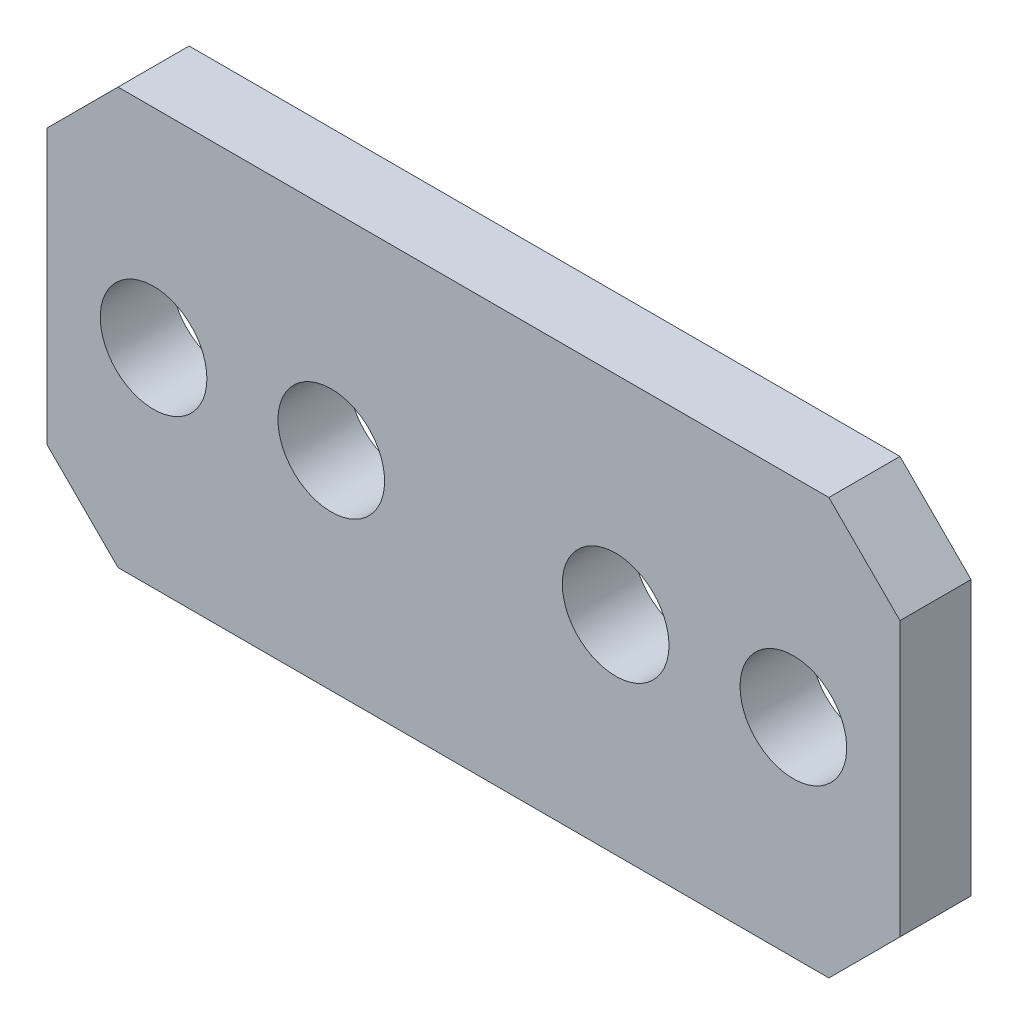
ISO-10303-21;
HEADER;
FILE_DESCRIPTION(('STEP AP214'),'2;1');
FILE_NAME('part.step','',(''),(''),'','','');
FILE_SCHEMA(('AUTOMOTIVE_DESIGN { 1 0 10303 214 1 1 1 1 }'));
ENDSEC;
DATA;
#1=APPLICATION_CONTEXT('core data for automotive mechanical design processes');
#2=APPLICATION_PROTOCOL_DEFINITION('international standard','automotive_design',2000,#1);
#3=PRODUCT_CONTEXT('',#1,'mechanical');
#4=PRODUCT('Part','Part','',(#3));
#5=PRODUCT_RELATED_PRODUCT_CATEGORY('part','',(#4));
#6=PRODUCT_DEFINITION_FORMATION('','',#4);
#7=PRODUCT_DEFINITION_CONTEXT('part definition',#1,'design');
#8=PRODUCT_DEFINITION('design','',#6,#7);
#9=PRODUCT_DEFINITION_SHAPE('','',#8);
#10=(LENGTH_UNIT() NAMED_UNIT(*) SI_UNIT(.MILLI.,.METRE.));
#11=(NAMED_UNIT(*) PLANE_ANGLE_UNIT() SI_UNIT($,.RADIAN.));
#12=(NAMED_UNIT(*) SI_UNIT($,.STERADIAN.) SOLID_ANGLE_UNIT());
#13=UNCERTAINTY_MEASURE_WITH_UNIT(LENGTH_MEASURE(1.E-05),#10,'distance_accuracy_value','');
#14=(GEOMETRIC_REPRESENTATION_CONTEXT(3) GLOBAL_UNCERTAINTY_ASSIGNED_CONTEXT((#13)) GLOBAL_UNIT_ASSIGNED_CONTEXT((#10,
#11,#12)) REPRESENTATION_CONTEXT('',''));
#15=CARTESIAN_POINT('',(0.,0.,0.));
#16=DIRECTION('',(0.,0.,1.));
#17=DIRECTION('',(1.,0.,0.));
#18=AXIS2_PLACEMENT_3D('',#15,#16,#17);
#19=CARTESIAN_POINT('',(0.,0.,2.));
#20=DIRECTION('',(0.,0.,1.));
#21=DIRECTION('',(1.,0.,0.));
#22=AXIS2_PLACEMENT_3D('',#19,#20,#21);
#23=PLANE('',#22);
#24=CARTESIAN_POINT('',(4.,0.,2.));
#25=DIRECTION('',(0.,0.,1.));
#26=DIRECTION('',(-1.,0.,0.));
#27=AXIS2_PLACEMENT_3D('',#24,#25,#26);
#28=CIRCLE('',#27,1.5);
#29=CARTESIAN_POINT('',(2.5,0.,2.));
#30=VERTEX_POINT('',#29);
#31=EDGE_CURVE('E188',#30,#30,#28,.T.);
#32=ORIENTED_EDGE('',*,*,#31,.F.);
#33=EDGE_LOOP('',(#32));
#34=FACE_BOUND('',#33,.T.);
#35=CARTESIAN_POINT('',(-9.,0.,2.));
#36=DIRECTION('',(0.,0.,1.));
#37=DIRECTION('',(1.,0.,0.));
#38=AXIS2_PLACEMENT_3D('',#35,#36,#37);
#39=CIRCLE('',#38,1.5);
#40=CARTESIAN_POINT('',(-7.5,0.,2.));
#41=VERTEX_POINT('',#40);
#42=EDGE_CURVE('E134',#41,#41,#39,.T.);
#43=ORIENTED_EDGE('',*,*,#42,.F.);
#44=EDGE_LOOP('',(#43));
#45=FACE_BOUND('',#44,.T.);
#46=DIRECTION('',(0.,1.,0.));
#47=VECTOR('',#46,1.);
#48=CARTESIAN_POINT('',(12.,5.85424868893541,2.));
#49=LINE('',#48,#47);
#50=CARTESIAN_POINT('',(12.,-3.8542486889354,2.));
#51=VERTEX_POINT('',#50);
#52=CARTESIAN_POINT('',(12.,3.8542486889354,2.));
#53=VERTEX_POINT('',#52);
#54=EDGE_CURVE('E139',#51,#53,#49,.T.);
#55=ORIENTED_EDGE('',*,*,#54,.T.);
#56=DIRECTION('',(0.707106781186547,-0.707106781186548,0.));
#57=VECTOR('',#56,1.);
#58=CARTESIAN_POINT('',(7.92712434446771,7.92712434446769,2.));
#59=LINE('',#58,#57);
#60=CARTESIAN_POINT('',(10.,5.85424868893541,2.));
#61=VERTEX_POINT('',#60);
#62=EDGE_CURVE('E154',#53,#61,#59,.F.);
#63=ORIENTED_EDGE('',*,*,#62,.T.);
#64=DIRECTION('',(-1.,0.,0.));
#65=VECTOR('',#64,1.);
#66=CARTESIAN_POINT('',(-12.,5.85424868893541,2.));
#67=LINE('',#66,#65);
#68=CARTESIAN_POINT('',(-9.99999999999999,5.85424868893541,2.));
#69=VERTEX_POINT('',#68);
#70=EDGE_CURVE('E121',#61,#69,#67,.T.);
#71=ORIENTED_EDGE('',*,*,#70,.T.);
#72=DIRECTION('',(0.707106781186549,0.707106781186546,0.));
#73=VECTOR('',#72,1.);
#74=CARTESIAN_POINT('',(-7.92712434446768,7.92712434446771,2.));
#75=LINE('',#74,#73);
#76=CARTESIAN_POINT('',(-12.,3.8542486889354,2.));
#77=VERTEX_POINT('',#76);
#78=EDGE_CURVE('E149',#69,#77,#75,.F.);
#79=ORIENTED_EDGE('',*,*,#78,.T.);
#80=DIRECTION('',(0.,-1.,0.));
#81=VECTOR('',#80,1.);
#82=CARTESIAN_POINT('',(-12.,5.85424868893541,2.));
#83=LINE('',#82,#81);
#84=CARTESIAN_POINT('',(-12.,-3.85424868893539,2.));
#85=VERTEX_POINT('',#84);
#86=EDGE_CURVE('E165',#77,#85,#83,.T.);
#87=ORIENTED_EDGE('',*,*,#86,.T.);
#88=DIRECTION('',(-0.707106781186546,0.707106781186549,0.));
#89=VECTOR('',#88,1.);
#90=CARTESIAN_POINT('',(-7.92712434446772,-7.92712434446769,2.));
#91=LINE('',#90,#89);
#92=CARTESIAN_POINT('',(-10.,-5.85424868893541,2.));
#93=VERTEX_POINT('',#92);
#94=EDGE_CURVE('E57',#85,#93,#91,.F.);
#95=ORIENTED_EDGE('',*,*,#94,.T.);
#96=DIRECTION('',(1.,0.,0.));
#97=VECTOR('',#96,1.);
#98=CARTESIAN_POINT('',(-12.,-5.85424868893541,2.));
#99=LINE('',#98,#97);
#100=CARTESIAN_POINT('',(9.99999999999999,-5.85424868893541,2.));
#101=VERTEX_POINT('',#100);
#102=EDGE_CURVE('E140',#93,#101,#99,.T.);
#103=ORIENTED_EDGE('',*,*,#102,.T.);
#104=DIRECTION('',(-0.707106781186549,-0.707106781186546,0.));
#105=VECTOR('',#104,1.);
#106=CARTESIAN_POINT('',(7.92712434446768,-7.92712434446771,2.));
#107=LINE('',#106,#105);
#108=EDGE_CURVE('E152',#101,#51,#107,.F.);
#109=ORIENTED_EDGE('',*,*,#108,.T.);
#110=EDGE_LOOP('',(#55,#63,#71,#79,#87,#95,#103,#109));
#111=FACE_BOUND('',#110,.T.);
#112=CARTESIAN_POINT('',(-4.,0.,2.));
#113=DIRECTION('',(0.,0.,1.));
#114=DIRECTION('',(1.,0.,0.));
#115=AXIS2_PLACEMENT_3D('',#112,#113,#114);
#116=CIRCLE('',#115,1.5);
#117=CARTESIAN_POINT('',(-2.5,0.,2.));
#118=VERTEX_POINT('',#117);
#119=EDGE_CURVE('E182',#118,#118,#116,.T.);
#120=ORIENTED_EDGE('',*,*,#119,.F.);
#121=EDGE_LOOP('',(#120));
#122=FACE_BOUND('',#121,.T.);
#123=CARTESIAN_POINT('',(9.,0.,2.));
#124=DIRECTION('',(0.,0.,1.));
#125=DIRECTION('',(-1.,0.,0.));
#126=AXIS2_PLACEMENT_3D('',#123,#124,#125);
#127=CIRCLE('',#126,1.5);
#128=CARTESIAN_POINT('',(7.5,0.,2.));
#129=VERTEX_POINT('',#128);
#130=EDGE_CURVE('E194',#129,#129,#127,.T.);
#131=ORIENTED_EDGE('',*,*,#130,.F.);
#132=EDGE_LOOP('',(#131));
#133=FACE_BOUND('',#132,.T.);
#134=ADVANCED_FACE('F35',(#34,#45,#111,#122,#133),#23,.T.);
#135=CARTESIAN_POINT('',(0.,0.,0.));
#136=DIRECTION('',(0.,0.,1.));
#137=DIRECTION('',(1.,0.,0.));
#138=AXIS2_PLACEMENT_3D('',#135,#136,#137);
#139=PLANE('',#138);
#140=DIRECTION('',(-1.,0.,0.));
#141=VECTOR('',#140,1.);
#142=CARTESIAN_POINT('',(-12.,5.85424868893541,0.));
#143=LINE('',#142,#141);
#144=CARTESIAN_POINT('',(10.,5.85424868893541,0.));
#145=VERTEX_POINT('',#144);
#146=CARTESIAN_POINT('',(-9.99999999999999,5.85424868893541,0.));
#147=VERTEX_POINT('',#146);
#148=EDGE_CURVE('E118',#145,#147,#143,.T.);
#149=ORIENTED_EDGE('',*,*,#148,.F.);
#150=DIRECTION('',(-0.707106781186547,0.707106781186548,0.));
#151=VECTOR('',#150,1.);
#152=CARTESIAN_POINT('',(10.,5.85424868893541,0.));
#153=LINE('',#152,#151);
#154=CARTESIAN_POINT('',(12.,3.8542486889354,0.));
#155=VERTEX_POINT('',#154);
#156=EDGE_CURVE('E101',#145,#155,#153,.F.);
#157=ORIENTED_EDGE('',*,*,#156,.T.);
#158=DIRECTION('',(0.,1.,0.));
#159=VECTOR('',#158,1.);
#160=CARTESIAN_POINT('',(12.,5.85424868893541,0.));
#161=LINE('',#160,#159);
#162=CARTESIAN_POINT('',(12.,-3.8542486889354,0.));
#163=VERTEX_POINT('',#162);
#164=EDGE_CURVE('E129',#163,#155,#161,.T.);
#165=ORIENTED_EDGE('',*,*,#164,.F.);
#166=DIRECTION('',(0.707106781186549,0.707106781186546,0.));
#167=VECTOR('',#166,1.);
#168=CARTESIAN_POINT('',(12.,-3.8542486889354,0.));
#169=LINE('',#168,#167);
#170=CARTESIAN_POINT('',(9.99999999999999,-5.85424868893541,0.));
#171=VERTEX_POINT('',#170);
#172=EDGE_CURVE('E112',#163,#171,#169,.F.);
#173=ORIENTED_EDGE('',*,*,#172,.T.);
#174=DIRECTION('',(1.,0.,0.));
#175=VECTOR('',#174,1.);
#176=CARTESIAN_POINT('',(-12.,-5.85424868893541,0.));
#177=LINE('',#176,#175);
#178=CARTESIAN_POINT('',(-10.,-5.85424868893541,0.));
#179=VERTEX_POINT('',#178);
#180=EDGE_CURVE('E132',#179,#171,#177,.T.);
#181=ORIENTED_EDGE('',*,*,#180,.F.);
#182=DIRECTION('',(0.707106781186546,-0.707106781186549,0.));
#183=VECTOR('',#182,1.);
#184=CARTESIAN_POINT('',(-10.,-5.85424868893541,0.));
#185=LINE('',#184,#183);
#186=CARTESIAN_POINT('',(-12.,-3.85424868893539,0.));
#187=VERTEX_POINT('',#186);
#188=EDGE_CURVE('E143',#179,#187,#185,.F.);
#189=ORIENTED_EDGE('',*,*,#188,.T.);
#190=DIRECTION('',(0.,-1.,0.));
#191=VECTOR('',#190,1.);
#192=CARTESIAN_POINT('',(-12.,5.85424868893541,0.));
#193=LINE('',#192,#191);
#194=CARTESIAN_POINT('',(-12.,3.8542486889354,0.));
#195=VERTEX_POINT('',#194);
#196=EDGE_CURVE('E128',#195,#187,#193,.T.);
#197=ORIENTED_EDGE('',*,*,#196,.F.);
#198=DIRECTION('',(-0.707106781186549,-0.707106781186546,0.));
#199=VECTOR('',#198,1.);
#200=CARTESIAN_POINT('',(-12.,3.8542486889354,0.));
#201=LINE('',#200,#199);
#202=EDGE_CURVE('E122',#195,#147,#201,.F.);
#203=ORIENTED_EDGE('',*,*,#202,.T.);
#204=EDGE_LOOP('',(#149,#157,#165,#173,#181,#189,#197,#203));
#205=FACE_BOUND('',#204,.T.);
#206=CARTESIAN_POINT('',(-9.,0.,0.));
#207=DIRECTION('',(0.,0.,1.));
#208=DIRECTION('',(1.,0.,0.));
#209=AXIS2_PLACEMENT_3D('',#206,#207,#208);
#210=CIRCLE('',#209,1.5);
#211=CARTESIAN_POINT('',(-7.5,0.,0.));
#212=VERTEX_POINT('',#211);
#213=EDGE_CURVE('E179',#212,#212,#210,.T.);
#214=ORIENTED_EDGE('',*,*,#213,.T.);
#215=EDGE_LOOP('',(#214));
#216=FACE_BOUND('',#215,.T.);
#217=CARTESIAN_POINT('',(-4.,0.,0.));
#218=DIRECTION('',(0.,0.,1.));
#219=DIRECTION('',(1.,0.,0.));
#220=AXIS2_PLACEMENT_3D('',#217,#218,#219);
#221=CIRCLE('',#220,1.5);
#222=CARTESIAN_POINT('',(-2.5,0.,0.));
#223=VERTEX_POINT('',#222);
#224=EDGE_CURVE('E185',#223,#223,#221,.T.);
#225=ORIENTED_EDGE('',*,*,#224,.T.);
#226=EDGE_LOOP('',(#225));
#227=FACE_BOUND('',#226,.T.);
#228=CARTESIAN_POINT('',(4.,0.,0.));
#229=DIRECTION('',(0.,0.,1.));
#230=DIRECTION('',(-1.,0.,0.));
#231=AXIS2_PLACEMENT_3D('',#228,#229,#230);
#232=CIRCLE('',#231,1.5);
#233=CARTESIAN_POINT('',(2.5,0.,0.));
#234=VERTEX_POINT('',#233);
#235=EDGE_CURVE('E191',#234,#234,#232,.T.);
#236=ORIENTED_EDGE('',*,*,#235,.T.);
#237=EDGE_LOOP('',(#236));
#238=FACE_BOUND('',#237,.T.);
#239=CARTESIAN_POINT('',(9.,0.,0.));
#240=DIRECTION('',(0.,0.,1.));
#241=DIRECTION('',(-1.,0.,0.));
#242=AXIS2_PLACEMENT_3D('',#239,#240,#241);
#243=CIRCLE('',#242,1.5);
#244=CARTESIAN_POINT('',(7.5,0.,0.));
#245=VERTEX_POINT('',#244);
#246=EDGE_CURVE('E197',#245,#245,#243,.T.);
#247=ORIENTED_EDGE('',*,*,#246,.T.);
#248=EDGE_LOOP('',(#247));
#249=FACE_BOUND('',#248,.T.);
#250=ADVANCED_FACE('F125',(#205,#216,#227,#238,#249),#139,.F.);
#251=CARTESIAN_POINT('',(12.,5.85424868893541,2.));
#252=DIRECTION('',(-1.,0.,0.));
#253=DIRECTION('',(0.,0.,1.));
#254=AXIS2_PLACEMENT_3D('',#251,#252,#253);
#255=PLANE('',#254);
#256=ORIENTED_EDGE('',*,*,#164,.T.);
#257=DIRECTION('',(0.,0.,1.));
#258=VECTOR('',#257,1.);
#259=CARTESIAN_POINT('',(12.,3.8542486889354,2.));
#260=LINE('',#259,#258);
#261=EDGE_CURVE('E106',#155,#53,#260,.T.);
#262=ORIENTED_EDGE('',*,*,#261,.T.);
#263=ORIENTED_EDGE('',*,*,#54,.F.);
#264=DIRECTION('',(0.,0.,-1.));
#265=VECTOR('',#264,1.);
#266=CARTESIAN_POINT('',(12.,-3.8542486889354,2.));
#267=LINE('',#266,#265);
#268=EDGE_CURVE('E111',#51,#163,#267,.T.);
#269=ORIENTED_EDGE('',*,*,#268,.T.);
#270=EDGE_LOOP('',(#256,#262,#263,#269));
#271=FACE_BOUND('',#270,.T.);
#272=ADVANCED_FACE('F212',(#271),#255,.F.);
#273=CARTESIAN_POINT('',(-12.,5.85424868893541,2.));
#274=DIRECTION('',(0.,-1.,0.));
#275=DIRECTION('',(0.,0.,-1.));
#276=AXIS2_PLACEMENT_3D('',#273,#274,#275);
#277=PLANE('',#276);
#278=ORIENTED_EDGE('',*,*,#70,.F.);
#279=DIRECTION('',(0.,0.,-1.));
#280=VECTOR('',#279,1.);
#281=CARTESIAN_POINT('',(10.,5.85424868893541,2.));
#282=LINE('',#281,#280);
#283=EDGE_CURVE('E105',#61,#145,#282,.T.);
#284=ORIENTED_EDGE('',*,*,#283,.T.);
#285=ORIENTED_EDGE('',*,*,#148,.T.);
#286=DIRECTION('',(0.,0.,1.));
#287=VECTOR('',#286,1.);
#288=CARTESIAN_POINT('',(-9.99999999999999,5.85424868893541,2.));
#289=LINE('',#288,#287);
#290=EDGE_CURVE('E123',#147,#69,#289,.T.);
#291=ORIENTED_EDGE('',*,*,#290,.T.);
#292=EDGE_LOOP('',(#278,#284,#285,#291));
#293=FACE_BOUND('',#292,.T.);
#294=ADVANCED_FACE('F117',(#293),#277,.F.);
#295=CARTESIAN_POINT('',(-12.,5.85424868893541,2.));
#296=DIRECTION('',(1.,0.,0.));
#297=DIRECTION('',(0.,0.,-1.));
#298=AXIS2_PLACEMENT_3D('',#295,#296,#297);
#299=PLANE('',#298);
#300=ORIENTED_EDGE('',*,*,#196,.T.);
#301=DIRECTION('',(0.,0.,1.));
#302=VECTOR('',#301,1.);
#303=CARTESIAN_POINT('',(-12.,-3.85424868893539,2.));
#304=LINE('',#303,#302);
#305=EDGE_CURVE('E11',#187,#85,#304,.T.);
#306=ORIENTED_EDGE('',*,*,#305,.T.);
#307=ORIENTED_EDGE('',*,*,#86,.F.);
#308=DIRECTION('',(0.,0.,-1.));
#309=VECTOR('',#308,1.);
#310=CARTESIAN_POINT('',(-12.,3.8542486889354,2.));
#311=LINE('',#310,#309);
#312=EDGE_CURVE('E43',#77,#195,#311,.T.);
#313=ORIENTED_EDGE('',*,*,#312,.T.);
#314=EDGE_LOOP('',(#300,#306,#307,#313));
#315=FACE_BOUND('',#314,.T.);
#316=ADVANCED_FACE('F163',(#315),#299,.F.);
#317=CARTESIAN_POINT('',(-12.,-5.85424868893541,2.));
#318=DIRECTION('',(0.,1.,0.));
#319=DIRECTION('',(0.,0.,1.));
#320=AXIS2_PLACEMENT_3D('',#317,#318,#319);
#321=PLANE('',#320);
#322=ORIENTED_EDGE('',*,*,#180,.T.);
#323=DIRECTION('',(0.,0.,1.));
#324=VECTOR('',#323,1.);
#325=CARTESIAN_POINT('',(9.99999999999999,-5.85424868893541,2.));
#326=LINE('',#325,#324);
#327=EDGE_CURVE('E50',#171,#101,#326,.T.);
#328=ORIENTED_EDGE('',*,*,#327,.T.);
#329=ORIENTED_EDGE('',*,*,#102,.F.);
#330=DIRECTION('',(0.,0.,-1.));
#331=VECTOR('',#330,1.);
#332=CARTESIAN_POINT('',(-10.,-5.85424868893541,2.));
#333=LINE('',#332,#331);
#334=EDGE_CURVE('E156',#93,#179,#333,.T.);
#335=ORIENTED_EDGE('',*,*,#334,.T.);
#336=EDGE_LOOP('',(#322,#328,#329,#335));
#337=FACE_BOUND('',#336,.T.);
#338=ADVANCED_FACE('F172',(#337),#321,.F.);
#339=CARTESIAN_POINT('',(-9.,0.,2.));
#340=DIRECTION('',(0.,0.,-1.));
#341=DIRECTION('',(-1.,0.,0.));
#342=AXIS2_PLACEMENT_3D('',#339,#340,#341);
#343=CYLINDRICAL_SURFACE('',#342,1.5);
#344=ORIENTED_EDGE('',*,*,#42,.T.);
#345=EDGE_LOOP('',(#344));
#346=FACE_BOUND('',#345,.T.);
#347=ORIENTED_EDGE('',*,*,#213,.F.);
#348=EDGE_LOOP('',(#347));
#349=FACE_BOUND('',#348,.T.);
#350=ADVANCED_FACE('F217',(#346,#349),#343,.F.);
#351=CARTESIAN_POINT('',(-4.,0.,2.));
#352=DIRECTION('',(0.,0.,-1.));
#353=DIRECTION('',(-1.,0.,0.));
#354=AXIS2_PLACEMENT_3D('',#351,#352,#353);
#355=CYLINDRICAL_SURFACE('',#354,1.5);
#356=ORIENTED_EDGE('',*,*,#119,.T.);
#357=EDGE_LOOP('',(#356));
#358=FACE_BOUND('',#357,.T.);
#359=ORIENTED_EDGE('',*,*,#224,.F.);
#360=EDGE_LOOP('',(#359));
#361=FACE_BOUND('',#360,.T.);
#362=ADVANCED_FACE('F245',(#358,#361),#355,.F.);
#363=CARTESIAN_POINT('',(4.,0.,2.));
#364=DIRECTION('',(0.,0.,-1.));
#365=DIRECTION('',(-1.,0.,0.));
#366=AXIS2_PLACEMENT_3D('',#363,#364,#365);
#367=CYLINDRICAL_SURFACE('',#366,1.5);
#368=ORIENTED_EDGE('',*,*,#31,.T.);
#369=EDGE_LOOP('',(#368));
#370=FACE_BOUND('',#369,.T.);
#371=ORIENTED_EDGE('',*,*,#235,.F.);
#372=EDGE_LOOP('',(#371));
#373=FACE_BOUND('',#372,.T.);
#374=ADVANCED_FACE('F248',(#370,#373),#367,.F.);
#375=CARTESIAN_POINT('',(9.,0.,2.));
#376=DIRECTION('',(0.,0.,-1.));
#377=DIRECTION('',(-1.,0.,0.));
#378=AXIS2_PLACEMENT_3D('',#375,#376,#377);
#379=CYLINDRICAL_SURFACE('',#378,1.5);
#380=ORIENTED_EDGE('',*,*,#130,.T.);
#381=EDGE_LOOP('',(#380));
#382=FACE_BOUND('',#381,.T.);
#383=ORIENTED_EDGE('',*,*,#246,.F.);
#384=EDGE_LOOP('',(#383));
#385=FACE_BOUND('',#384,.T.);
#386=ADVANCED_FACE('F203',(#382,#385),#379,.F.);
#387=CARTESIAN_POINT('',(10.,5.85424868893541,2.));
#388=DIRECTION('',(-0.707106781186548,-0.707106781186547,0.));
#389=DIRECTION('',(0.,0.,-1.));
#390=AXIS2_PLACEMENT_3D('',#387,#388,#389);
#391=PLANE('',#390);
#392=ORIENTED_EDGE('',*,*,#62,.F.);
#393=ORIENTED_EDGE('',*,*,#261,.F.);
#394=ORIENTED_EDGE('',*,*,#156,.F.);
#395=ORIENTED_EDGE('',*,*,#283,.F.);
#396=EDGE_LOOP('',(#392,#393,#394,#395));
#397=FACE_BOUND('',#396,.T.);
#398=ADVANCED_FACE('F104',(#397),#391,.F.);
#399=CARTESIAN_POINT('',(12.,-3.8542486889354,2.));
#400=DIRECTION('',(-0.707106781186546,0.707106781186549,0.));
#401=DIRECTION('',(0.,0.,-1.));
#402=AXIS2_PLACEMENT_3D('',#399,#400,#401);
#403=PLANE('',#402);
#404=ORIENTED_EDGE('',*,*,#108,.F.);
#405=ORIENTED_EDGE('',*,*,#327,.F.);
#406=ORIENTED_EDGE('',*,*,#172,.F.);
#407=ORIENTED_EDGE('',*,*,#268,.F.);
#408=EDGE_LOOP('',(#404,#405,#406,#407));
#409=FACE_BOUND('',#408,.T.);
#410=ADVANCED_FACE('F231',(#409),#403,.F.);
#411=CARTESIAN_POINT('',(-10.,-5.85424868893541,2.));
#412=DIRECTION('',(0.707106781186549,0.707106781186546,0.));
#413=DIRECTION('',(0.,0.,-1.));
#414=AXIS2_PLACEMENT_3D('',#411,#412,#413);
#415=PLANE('',#414);
#416=ORIENTED_EDGE('',*,*,#94,.F.);
#417=ORIENTED_EDGE('',*,*,#305,.F.);
#418=ORIENTED_EDGE('',*,*,#188,.F.);
#419=ORIENTED_EDGE('',*,*,#334,.F.);
#420=EDGE_LOOP('',(#416,#417,#418,#419));
#421=FACE_BOUND('',#420,.T.);
#422=ADVANCED_FACE('F171',(#421),#415,.F.);
#423=CARTESIAN_POINT('',(-12.,3.8542486889354,2.));
#424=DIRECTION('',(0.707106781186546,-0.707106781186549,0.));
#425=DIRECTION('',(0.,0.,-1.));
#426=AXIS2_PLACEMENT_3D('',#423,#424,#425);
#427=PLANE('',#426);
#428=ORIENTED_EDGE('',*,*,#78,.F.);
#429=ORIENTED_EDGE('',*,*,#290,.F.);
#430=ORIENTED_EDGE('',*,*,#202,.F.);
#431=ORIENTED_EDGE('',*,*,#312,.F.);
#432=EDGE_LOOP('',(#428,#429,#430,#431));
#433=FACE_BOUND('',#432,.T.);
#434=ADVANCED_FACE('F37',(#433),#427,.F.);
#435=CLOSED_SHELL('',(#134,#250,#272,#294,#316,#338,#350,#362,#374,#386,#398,#410,#422,#434));
#436=MANIFOLD_SOLID_BREP('B2',#435);
#437=ADVANCED_BREP_SHAPE_REPRESENTATION('',(#18,#436),#14);
#438=SHAPE_DEFINITION_REPRESENTATION(#9,#437);
ENDSEC;
END-ISO-10303-21;
